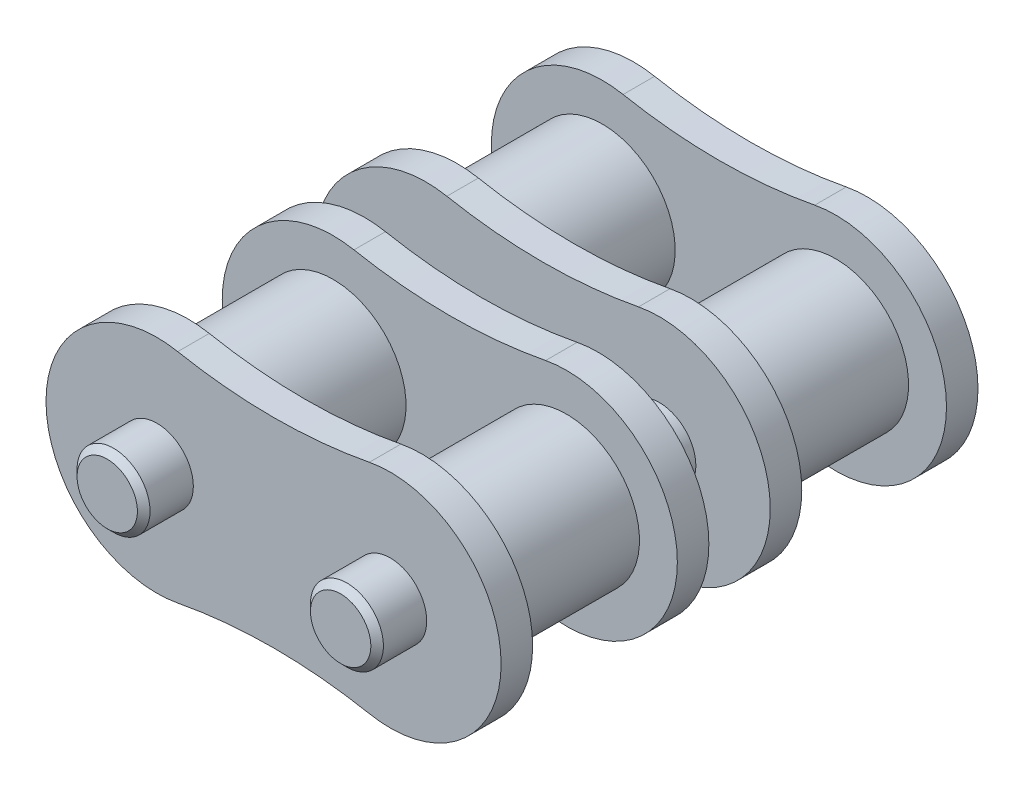
ISO-10303-21;
HEADER;
FILE_DESCRIPTION(('STEP AP214'),'2;1');
FILE_NAME('part.step','',(''),(''),'','','');
FILE_SCHEMA(('AUTOMOTIVE_DESIGN { 1 0 10303 214 1 1 1 1 }'));
ENDSEC;
DATA;
#1=APPLICATION_CONTEXT('core data for automotive mechanical design processes');
#2=APPLICATION_PROTOCOL_DEFINITION('international standard','automotive_design',2000,#1);
#3=PRODUCT_CONTEXT('',#1,'mechanical');
#4=PRODUCT('Part','Part','',(#3));
#5=PRODUCT_RELATED_PRODUCT_CATEGORY('part','',(#4));
#6=PRODUCT_DEFINITION_FORMATION('','',#4);
#7=PRODUCT_DEFINITION_CONTEXT('part definition',#1,'design');
#8=PRODUCT_DEFINITION('design','',#6,#7);
#9=PRODUCT_DEFINITION_SHAPE('','',#8);
#10=(LENGTH_UNIT() NAMED_UNIT(*) SI_UNIT(.MILLI.,.METRE.));
#11=(NAMED_UNIT(*) PLANE_ANGLE_UNIT() SI_UNIT($,.RADIAN.));
#12=(NAMED_UNIT(*) SI_UNIT($,.STERADIAN.) SOLID_ANGLE_UNIT());
#13=UNCERTAINTY_MEASURE_WITH_UNIT(LENGTH_MEASURE(1.E-05),#10,'distance_accuracy_value','');
#14=(GEOMETRIC_REPRESENTATION_CONTEXT(3) GLOBAL_UNCERTAINTY_ASSIGNED_CONTEXT((#13)) GLOBAL_UNIT_ASSIGNED_CONTEXT((#10,
#11,#12)) REPRESENTATION_CONTEXT('',''));
#15=CARTESIAN_POINT('',(0.,0.,0.));
#16=DIRECTION('',(0.,0.,1.));
#17=DIRECTION('',(1.,0.,0.));
#18=AXIS2_PLACEMENT_3D('',#15,#16,#17);
#19=CARTESIAN_POINT('',(-6.35,-33.119427631579,40.595));
#20=DIRECTION('',(0.,0.,1.));
#21=DIRECTION('',(1.,0.,0.));
#22=AXIS2_PLACEMENT_3D('',#19,#20,#21);
#23=PLANE('',#22);
#24=CARTESIAN_POINT('',(12.7,0.,40.595));
#25=DIRECTION('',(0.,0.,1.));
#26=DIRECTION('',(1.,0.,0.));
#27=AXIS2_PLACEMENT_3D('',#24,#25,#26);
#28=CIRCLE('',#27,3.97);
#29=CARTESIAN_POINT('',(16.67,0.,40.595));
#30=VERTEX_POINT('',#29);
#31=EDGE_CURVE('E243',#30,#30,#28,.F.);
#32=ORIENTED_EDGE('',*,*,#31,.T.);
#33=EDGE_LOOP('',(#32));
#34=FACE_BOUND('',#33,.T.);
#35=CARTESIAN_POINT('',(0.,-66.238855263158,40.595));
#36=DIRECTION('',(0.,0.,-1.));
#37=DIRECTION('',(1.,0.,0.));
#38=AXIS2_PLACEMENT_3D('',#35,#36,#37);
#39=CIRCLE('',#38,55.380355263158);
#40=CARTESIAN_POINT('',(-10.4281534154258,-11.8491745744655,40.595));
#41=VERTEX_POINT('',#40);
#42=CARTESIAN_POINT('',(10.4281534154258,-11.8491745744654,40.595));
#43=VERTEX_POINT('',#42);
#44=EDGE_CURVE('E286',#41,#43,#39,.T.);
#45=ORIENTED_EDGE('',*,*,#44,.T.);
#46=CARTESIAN_POINT('',(12.7,0.,40.595));
#47=DIRECTION('',(0.,0.,1.));
#48=DIRECTION('',(1.,0.,0.));
#49=AXIS2_PLACEMENT_3D('',#46,#47,#48);
#50=CIRCLE('',#49,12.065);
#51=CARTESIAN_POINT('',(10.4281534154258,11.8491745744655,40.595));
#52=VERTEX_POINT('',#51);
#53=EDGE_CURVE('E80',#43,#52,#50,.T.);
#54=ORIENTED_EDGE('',*,*,#53,.T.);
#55=CARTESIAN_POINT('',(0.,66.238855263158,40.595));
#56=DIRECTION('',(0.,0.,-1.));
#57=DIRECTION('',(1.,0.,0.));
#58=AXIS2_PLACEMENT_3D('',#55,#56,#57);
#59=CIRCLE('',#58,55.380355263158);
#60=CARTESIAN_POINT('',(-10.4281534154258,11.8491745744655,40.595));
#61=VERTEX_POINT('',#60);
#62=EDGE_CURVE('E289',#52,#61,#59,.T.);
#63=ORIENTED_EDGE('',*,*,#62,.T.);
#64=CARTESIAN_POINT('',(-12.7,0.,40.595));
#65=DIRECTION('',(0.,0.,1.));
#66=DIRECTION('',(1.,0.,0.));
#67=AXIS2_PLACEMENT_3D('',#64,#65,#66);
#68=CIRCLE('',#67,12.065);
#69=EDGE_CURVE('E48',#61,#41,#68,.T.);
#70=ORIENTED_EDGE('',*,*,#69,.T.);
#71=EDGE_LOOP('',(#45,#54,#63,#70));
#72=FACE_BOUND('',#71,.T.);
#73=CARTESIAN_POINT('',(-12.7,0.,40.595));
#74=DIRECTION('',(0.,0.,1.));
#75=DIRECTION('',(1.,0.,0.));
#76=AXIS2_PLACEMENT_3D('',#73,#74,#75);
#77=CIRCLE('',#76,3.97);
#78=CARTESIAN_POINT('',(-8.73,0.,40.595));
#79=VERTEX_POINT('',#78);
#80=EDGE_CURVE('E190',#79,#79,#77,.F.);
#81=ORIENTED_EDGE('',*,*,#80,.T.);
#82=EDGE_LOOP('',(#81));
#83=FACE_BOUND('',#82,.T.);
#84=ADVANCED_FACE('F31',(#34,#72,#83),#23,.T.);
#85=CARTESIAN_POINT('',(-6.35,-33.119427631579,17.985));
#86=DIRECTION('',(0.,0.,-1.));
#87=DIRECTION('',(1.,0.,0.));
#88=AXIS2_PLACEMENT_3D('',#85,#86,#87);
#89=PLANE('',#88);
#90=CARTESIAN_POINT('',(12.7,0.,17.985));
#91=DIRECTION('',(0.,0.,-1.));
#92=DIRECTION('',(-1.,0.,0.));
#93=AXIS2_PLACEMENT_3D('',#90,#91,#92);
#94=CIRCLE('',#93,3.97);
#95=CARTESIAN_POINT('',(8.73,0.,17.985));
#96=VERTEX_POINT('',#95);
#97=EDGE_CURVE('E247',#96,#96,#94,.F.);
#98=ORIENTED_EDGE('',*,*,#97,.T.);
#99=EDGE_LOOP('',(#98));
#100=FACE_BOUND('',#99,.T.);
#101=CARTESIAN_POINT('',(0.,-66.238855263158,17.985));
#102=DIRECTION('',(0.,0.,-1.));
#103=DIRECTION('',(1.,0.,0.));
#104=AXIS2_PLACEMENT_3D('',#101,#102,#103);
#105=CIRCLE('',#104,55.380355263158);
#106=CARTESIAN_POINT('',(-10.4281534154258,-11.8491745744655,17.985));
#107=VERTEX_POINT('',#106);
#108=CARTESIAN_POINT('',(10.4281534154258,-11.8491745744654,17.985));
#109=VERTEX_POINT('',#108);
#110=EDGE_CURVE('E248',#107,#109,#105,.T.);
#111=ORIENTED_EDGE('',*,*,#110,.F.);
#112=CARTESIAN_POINT('',(-12.7,0.,17.985));
#113=DIRECTION('',(0.,0.,1.));
#114=DIRECTION('',(1.,0.,0.));
#115=AXIS2_PLACEMENT_3D('',#112,#113,#114);
#116=CIRCLE('',#115,12.065);
#117=CARTESIAN_POINT('',(-10.4281534154258,11.8491745744655,17.985));
#118=VERTEX_POINT('',#117);
#119=EDGE_CURVE('E251',#118,#107,#116,.T.);
#120=ORIENTED_EDGE('',*,*,#119,.F.);
#121=CARTESIAN_POINT('',(0.,66.238855263158,17.985));
#122=DIRECTION('',(0.,0.,-1.));
#123=DIRECTION('',(1.,0.,0.));
#124=AXIS2_PLACEMENT_3D('',#121,#122,#123);
#125=CIRCLE('',#124,55.380355263158);
#126=CARTESIAN_POINT('',(10.4281534154258,11.8491745744655,17.985));
#127=VERTEX_POINT('',#126);
#128=EDGE_CURVE('E255',#127,#118,#125,.T.);
#129=ORIENTED_EDGE('',*,*,#128,.F.);
#130=CARTESIAN_POINT('',(12.7,0.,17.985));
#131=DIRECTION('',(0.,0.,1.));
#132=DIRECTION('',(1.,0.,0.));
#133=AXIS2_PLACEMENT_3D('',#130,#131,#132);
#134=CIRCLE('',#133,12.065);
#135=EDGE_CURVE('E258',#109,#127,#134,.T.);
#136=ORIENTED_EDGE('',*,*,#135,.F.);
#137=EDGE_LOOP('',(#111,#120,#129,#136));
#138=FACE_BOUND('',#137,.T.);
#139=CARTESIAN_POINT('',(-12.7,0.,17.985));
#140=DIRECTION('',(0.,0.,-1.));
#141=DIRECTION('',(-1.,0.,0.));
#142=AXIS2_PLACEMENT_3D('',#139,#140,#141);
#143=CIRCLE('',#142,3.97);
#144=CARTESIAN_POINT('',(-16.67,0.,17.985));
#145=VERTEX_POINT('',#144);
#146=EDGE_CURVE('E458',#145,#145,#143,.F.);
#147=ORIENTED_EDGE('',*,*,#146,.T.);
#148=EDGE_LOOP('',(#147));
#149=FACE_BOUND('',#148,.T.);
#150=ADVANCED_FACE('F355',(#100,#138,#149),#89,.T.);
#151=CARTESIAN_POINT('',(-6.35,-33.119427631579,11.305));
#152=DIRECTION('',(0.,0.,1.));
#153=DIRECTION('',(1.,0.,0.));
#154=AXIS2_PLACEMENT_3D('',#151,#152,#153);
#155=PLANE('',#154);
#156=CARTESIAN_POINT('',(12.7,0.,11.305));
#157=DIRECTION('',(0.,0.,1.));
#158=DIRECTION('',(1.,0.,0.));
#159=AXIS2_PLACEMENT_3D('',#156,#157,#158);
#160=CIRCLE('',#159,3.97);
#161=CARTESIAN_POINT('',(16.67,0.,11.305));
#162=VERTEX_POINT('',#161);
#163=EDGE_CURVE('E315',#162,#162,#160,.T.);
#164=ORIENTED_EDGE('',*,*,#163,.F.);
#165=EDGE_LOOP('',(#164));
#166=FACE_BOUND('',#165,.T.);
#167=CARTESIAN_POINT('',(0.,-66.238855263158,11.305));
#168=DIRECTION('',(0.,0.,-1.));
#169=DIRECTION('',(1.,0.,0.));
#170=AXIS2_PLACEMENT_3D('',#167,#168,#169);
#171=CIRCLE('',#170,55.380355263158);
#172=CARTESIAN_POINT('',(-10.4281534154258,-11.8491745744655,11.305));
#173=VERTEX_POINT('',#172);
#174=CARTESIAN_POINT('',(10.4281534154258,-11.8491745744654,11.305));
#175=VERTEX_POINT('',#174);
#176=EDGE_CURVE('E207',#173,#175,#171,.T.);
#177=ORIENTED_EDGE('',*,*,#176,.T.);
#178=CARTESIAN_POINT('',(12.7,0.,11.305));
#179=DIRECTION('',(0.,0.,1.));
#180=DIRECTION('',(1.,0.,0.));
#181=AXIS2_PLACEMENT_3D('',#178,#179,#180);
#182=CIRCLE('',#181,12.065);
#183=CARTESIAN_POINT('',(10.4281534154258,11.8491745744655,11.305));
#184=VERTEX_POINT('',#183);
#185=EDGE_CURVE('E210',#175,#184,#182,.T.);
#186=ORIENTED_EDGE('',*,*,#185,.T.);
#187=CARTESIAN_POINT('',(0.,66.238855263158,11.305));
#188=DIRECTION('',(0.,0.,-1.));
#189=DIRECTION('',(1.,0.,0.));
#190=AXIS2_PLACEMENT_3D('',#187,#188,#189);
#191=CIRCLE('',#190,55.380355263158);
#192=CARTESIAN_POINT('',(-10.4281534154258,11.8491745744655,11.305));
#193=VERTEX_POINT('',#192);
#194=EDGE_CURVE('E213',#184,#193,#191,.T.);
#195=ORIENTED_EDGE('',*,*,#194,.T.);
#196=CARTESIAN_POINT('',(-12.7,0.,11.305));
#197=DIRECTION('',(0.,0.,1.));
#198=DIRECTION('',(1.,0.,0.));
#199=AXIS2_PLACEMENT_3D('',#196,#197,#198);
#200=CIRCLE('',#199,12.065);
#201=EDGE_CURVE('E215',#193,#173,#200,.T.);
#202=ORIENTED_EDGE('',*,*,#201,.T.);
#203=EDGE_LOOP('',(#177,#186,#195,#202));
#204=FACE_BOUND('',#203,.T.);
#205=CARTESIAN_POINT('',(-12.7,0.,11.305));
#206=DIRECTION('',(0.,0.,1.));
#207=DIRECTION('',(1.,0.,0.));
#208=AXIS2_PLACEMENT_3D('',#205,#206,#207);
#209=CIRCLE('',#208,3.97);
#210=CARTESIAN_POINT('',(-8.73,0.,11.305));
#211=VERTEX_POINT('',#210);
#212=EDGE_CURVE('E323',#211,#211,#209,.F.);
#213=ORIENTED_EDGE('',*,*,#212,.T.);
#214=EDGE_LOOP('',(#213));
#215=FACE_BOUND('',#214,.T.);
#216=ADVANCED_FACE('F361',(#166,#204,#215),#155,.T.);
#217=CARTESIAN_POINT('',(-6.35,-33.119427631579,-11.305));
#218=DIRECTION('',(0.,0.,-1.));
#219=DIRECTION('',(1.,0.,0.));
#220=AXIS2_PLACEMENT_3D('',#217,#218,#219);
#221=PLANE('',#220);
#222=CARTESIAN_POINT('',(12.7,0.,-11.305));
#223=DIRECTION('',(0.,0.,-1.));
#224=DIRECTION('',(-1.,0.,0.));
#225=AXIS2_PLACEMENT_3D('',#222,#223,#224);
#226=CIRCLE('',#225,3.97);
#227=CARTESIAN_POINT('',(8.73,0.,-11.305));
#228=VERTEX_POINT('',#227);
#229=EDGE_CURVE('E242',#228,#228,#226,.T.);
#230=ORIENTED_EDGE('',*,*,#229,.F.);
#231=EDGE_LOOP('',(#230));
#232=FACE_BOUND('',#231,.T.);
#233=CARTESIAN_POINT('',(0.,-66.238855263158,-11.305));
#234=DIRECTION('',(0.,0.,-1.));
#235=DIRECTION('',(1.,0.,0.));
#236=AXIS2_PLACEMENT_3D('',#233,#234,#235);
#237=CIRCLE('',#236,55.380355263158);
#238=CARTESIAN_POINT('',(-10.4281534154258,-11.8491745744655,-11.305));
#239=VERTEX_POINT('',#238);
#240=CARTESIAN_POINT('',(10.4281534154258,-11.8491745744654,-11.305));
#241=VERTEX_POINT('',#240);
#242=EDGE_CURVE('E158',#239,#241,#237,.T.);
#243=ORIENTED_EDGE('',*,*,#242,.F.);
#244=CARTESIAN_POINT('',(-12.7,0.,-11.305));
#245=DIRECTION('',(0.,0.,1.));
#246=DIRECTION('',(1.,0.,0.));
#247=AXIS2_PLACEMENT_3D('',#244,#245,#246);
#248=CIRCLE('',#247,12.065);
#249=CARTESIAN_POINT('',(-10.4281534154258,11.8491745744655,-11.305));
#250=VERTEX_POINT('',#249);
#251=EDGE_CURVE('E174',#250,#239,#248,.T.);
#252=ORIENTED_EDGE('',*,*,#251,.F.);
#253=CARTESIAN_POINT('',(0.,66.238855263158,-11.305));
#254=DIRECTION('',(0.,0.,-1.));
#255=DIRECTION('',(1.,0.,0.));
#256=AXIS2_PLACEMENT_3D('',#253,#254,#255);
#257=CIRCLE('',#256,55.380355263158);
#258=CARTESIAN_POINT('',(10.4281534154258,11.8491745744655,-11.305));
#259=VERTEX_POINT('',#258);
#260=EDGE_CURVE('E181',#259,#250,#257,.T.);
#261=ORIENTED_EDGE('',*,*,#260,.F.);
#262=CARTESIAN_POINT('',(12.7,0.,-11.305));
#263=DIRECTION('',(0.,0.,1.));
#264=DIRECTION('',(1.,0.,0.));
#265=AXIS2_PLACEMENT_3D('',#262,#263,#264);
#266=CIRCLE('',#265,12.065);
#267=EDGE_CURVE('E177',#241,#259,#266,.T.);
#268=ORIENTED_EDGE('',*,*,#267,.F.);
#269=EDGE_LOOP('',(#243,#252,#261,#268));
#270=FACE_BOUND('',#269,.T.);
#271=CARTESIAN_POINT('',(-12.7,0.,-11.305));
#272=DIRECTION('',(0.,0.,-1.));
#273=DIRECTION('',(-1.,0.,0.));
#274=AXIS2_PLACEMENT_3D('',#271,#272,#273);
#275=CIRCLE('',#274,3.97);
#276=CARTESIAN_POINT('',(-16.67,0.,-11.305));
#277=VERTEX_POINT('',#276);
#278=EDGE_CURVE('E320',#277,#277,#275,.F.);
#279=ORIENTED_EDGE('',*,*,#278,.T.);
#280=EDGE_LOOP('',(#279));
#281=FACE_BOUND('',#280,.T.);
#282=ADVANCED_FACE('F171',(#232,#270,#281),#221,.T.);
#283=CARTESIAN_POINT('',(12.7,0.,45.995));
#284=DIRECTION('',(0.,0.,-1.));
#285=DIRECTION('',(-1.,0.,0.));
#286=AXIS2_PLACEMENT_3D('',#283,#284,#285);
#287=CYLINDRICAL_SURFACE('',#286,3.97);
#288=ORIENTED_EDGE('',*,*,#163,.T.);
#289=EDGE_LOOP('',(#288));
#290=FACE_BOUND('',#289,.T.);
#291=ORIENTED_EDGE('',*,*,#97,.F.);
#292=EDGE_LOOP('',(#291));
#293=FACE_BOUND('',#292,.T.);
#294=ADVANCED_FACE('F372',(#290,#293),#287,.T.);
#295=CARTESIAN_POINT('',(-6.35,-33.119427631579,37.165));
#296=DIRECTION('',(0.,0.,1.));
#297=DIRECTION('',(1.,0.,0.));
#298=AXIS2_PLACEMENT_3D('',#295,#296,#297);
#299=PLANE('',#298);
#300=CARTESIAN_POINT('',(12.7,0.,37.165));
#301=DIRECTION('',(0.,0.,1.));
#302=DIRECTION('',(1.,0.,0.));
#303=AXIS2_PLACEMENT_3D('',#300,#301,#302);
#304=CIRCLE('',#303,7.94);
#305=CARTESIAN_POINT('',(20.64,0.,37.165));
#306=VERTEX_POINT('',#305);
#307=EDGE_CURVE('E306',#306,#306,#304,.T.);
#308=ORIENTED_EDGE('',*,*,#307,.T.);
#309=EDGE_LOOP('',(#308));
#310=FACE_BOUND('',#309,.T.);
#311=CARTESIAN_POINT('',(0.,-66.238855263158,37.165));
#312=DIRECTION('',(0.,0.,-1.));
#313=DIRECTION('',(1.,0.,0.));
#314=AXIS2_PLACEMENT_3D('',#311,#312,#313);
#315=CIRCLE('',#314,55.380355263158);
#316=CARTESIAN_POINT('',(-10.4281534154258,-11.8491745744655,37.165));
#317=VERTEX_POINT('',#316);
#318=CARTESIAN_POINT('',(10.4281534154258,-11.8491745744654,37.165));
#319=VERTEX_POINT('',#318);
#320=EDGE_CURVE('E285',#317,#319,#315,.T.);
#321=ORIENTED_EDGE('',*,*,#320,.F.);
#322=CARTESIAN_POINT('',(-12.7,0.,37.165));
#323=DIRECTION('',(0.,0.,1.));
#324=DIRECTION('',(1.,0.,0.));
#325=AXIS2_PLACEMENT_3D('',#322,#323,#324);
#326=CIRCLE('',#325,12.065);
#327=CARTESIAN_POINT('',(-10.4281534154258,11.8491745744655,37.165));
#328=VERTEX_POINT('',#327);
#329=EDGE_CURVE('E72',#328,#317,#326,.T.);
#330=ORIENTED_EDGE('',*,*,#329,.F.);
#331=CARTESIAN_POINT('',(0.,66.238855263158,37.165));
#332=DIRECTION('',(0.,0.,-1.));
#333=DIRECTION('',(1.,0.,0.));
#334=AXIS2_PLACEMENT_3D('',#331,#332,#333);
#335=CIRCLE('',#334,55.380355263158);
#336=CARTESIAN_POINT('',(10.4281534154258,11.8491745744655,37.165));
#337=VERTEX_POINT('',#336);
#338=EDGE_CURVE('E66',#337,#328,#335,.T.);
#339=ORIENTED_EDGE('',*,*,#338,.F.);
#340=CARTESIAN_POINT('',(12.7,0.,37.165));
#341=DIRECTION('',(0.,0.,1.));
#342=DIRECTION('',(1.,0.,0.));
#343=AXIS2_PLACEMENT_3D('',#340,#341,#342);
#344=CIRCLE('',#343,12.065);
#345=EDGE_CURVE('E295',#319,#337,#344,.T.);
#346=ORIENTED_EDGE('',*,*,#345,.F.);
#347=EDGE_LOOP('',(#321,#330,#339,#346));
#348=FACE_BOUND('',#347,.T.);
#349=CARTESIAN_POINT('',(-12.7,0.,37.165));
#350=DIRECTION('',(0.,0.,1.));
#351=DIRECTION('',(1.,0.,0.));
#352=AXIS2_PLACEMENT_3D('',#349,#350,#351);
#353=CIRCLE('',#352,7.94);
#354=CARTESIAN_POINT('',(-4.76,0.,37.165));
#355=VERTEX_POINT('',#354);
#356=EDGE_CURVE('E309',#355,#355,#353,.F.);
#357=ORIENTED_EDGE('',*,*,#356,.F.);
#358=EDGE_LOOP('',(#357));
#359=FACE_BOUND('',#358,.T.);
#360=ADVANCED_FACE('F368',(#310,#348,#359),#299,.F.);
#361=CARTESIAN_POINT('',(12.7,0.,37.165));
#362=DIRECTION('',(0.,0.,-1.));
#363=DIRECTION('',(-1.,0.,0.));
#364=AXIS2_PLACEMENT_3D('',#361,#362,#363);
#365=CYLINDRICAL_SURFACE('',#364,7.94);
#366=ORIENTED_EDGE('',*,*,#307,.F.);
#367=EDGE_LOOP('',(#366));
#368=FACE_BOUND('',#367,.T.);
#369=CARTESIAN_POINT('',(12.7,0.,21.415));
#370=DIRECTION('',(0.,0.,-1.));
#371=DIRECTION('',(-1.,0.,0.));
#372=AXIS2_PLACEMENT_3D('',#369,#370,#371);
#373=CIRCLE('',#372,7.94);
#374=CARTESIAN_POINT('',(4.76,0.,21.415));
#375=VERTEX_POINT('',#374);
#376=EDGE_CURVE('E282',#375,#375,#373,.T.);
#377=ORIENTED_EDGE('',*,*,#376,.F.);
#378=EDGE_LOOP('',(#377));
#379=FACE_BOUND('',#378,.T.);
#380=ADVANCED_FACE('F371',(#368,#379),#365,.T.);
#381=CARTESIAN_POINT('',(0.,-66.238855263158,40.595));
#382=DIRECTION('',(0.,0.,-1.));
#383=DIRECTION('',(-1.,0.,0.));
#384=AXIS2_PLACEMENT_3D('',#381,#382,#383);
#385=CYLINDRICAL_SURFACE('',#384,55.380355263158);
#386=ORIENTED_EDGE('',*,*,#320,.T.);
#387=DIRECTION('',(0.,0.,-1.));
#388=VECTOR('',#387,1.);
#389=CARTESIAN_POINT('',(10.4281534154258,-11.8491745744654,40.595));
#390=LINE('',#389,#388);
#391=EDGE_CURVE('E304',#43,#319,#390,.T.);
#392=ORIENTED_EDGE('',*,*,#391,.F.);
#393=ORIENTED_EDGE('',*,*,#44,.F.);
#394=DIRECTION('',(0.,0.,-1.));
#395=VECTOR('',#394,1.);
#396=CARTESIAN_POINT('',(-10.4281534154258,-11.8491745744655,40.595));
#397=LINE('',#396,#395);
#398=EDGE_CURVE('E292',#41,#317,#397,.T.);
#399=ORIENTED_EDGE('',*,*,#398,.T.);
#400=EDGE_LOOP('',(#386,#392,#393,#399));
#401=FACE_BOUND('',#400,.T.);
#402=ADVANCED_FACE('F383',(#401),#385,.F.);
#403=CARTESIAN_POINT('',(12.7,0.,40.595));
#404=DIRECTION('',(0.,0.,-1.));
#405=DIRECTION('',(-1.,0.,0.));
#406=AXIS2_PLACEMENT_3D('',#403,#404,#405);
#407=CYLINDRICAL_SURFACE('',#406,12.065);
#408=ORIENTED_EDGE('',*,*,#345,.T.);
#409=DIRECTION('',(0.,0.,-1.));
#410=VECTOR('',#409,1.);
#411=CARTESIAN_POINT('',(10.4281534154258,11.8491745744655,40.595));
#412=LINE('',#411,#410);
#413=EDGE_CURVE('E302',#52,#337,#412,.T.);
#414=ORIENTED_EDGE('',*,*,#413,.F.);
#415=ORIENTED_EDGE('',*,*,#53,.F.);
#416=ORIENTED_EDGE('',*,*,#391,.T.);
#417=EDGE_LOOP('',(#408,#414,#415,#416));
#418=FACE_BOUND('',#417,.T.);
#419=ADVANCED_FACE('F380',(#418),#407,.T.);
#420=CARTESIAN_POINT('',(0.,66.238855263158,40.595));
#421=DIRECTION('',(0.,0.,-1.));
#422=DIRECTION('',(-1.,0.,0.));
#423=AXIS2_PLACEMENT_3D('',#420,#421,#422);
#424=CYLINDRICAL_SURFACE('',#423,55.380355263158);
#425=ORIENTED_EDGE('',*,*,#338,.T.);
#426=DIRECTION('',(0.,0.,-1.));
#427=VECTOR('',#426,1.);
#428=CARTESIAN_POINT('',(-10.4281534154258,11.8491745744655,40.595));
#429=LINE('',#428,#427);
#430=EDGE_CURVE('E300',#61,#328,#429,.T.);
#431=ORIENTED_EDGE('',*,*,#430,.F.);
#432=ORIENTED_EDGE('',*,*,#62,.F.);
#433=ORIENTED_EDGE('',*,*,#413,.T.);
#434=EDGE_LOOP('',(#425,#431,#432,#433));
#435=FACE_BOUND('',#434,.T.);
#436=ADVANCED_FACE('F377',(#435),#424,.F.);
#437=CARTESIAN_POINT('',(-12.7,0.,40.595));
#438=DIRECTION('',(0.,0.,-1.));
#439=DIRECTION('',(-1.,0.,0.));
#440=AXIS2_PLACEMENT_3D('',#437,#438,#439);
#441=CYLINDRICAL_SURFACE('',#440,12.065);
#442=ORIENTED_EDGE('',*,*,#329,.T.);
#443=ORIENTED_EDGE('',*,*,#398,.F.);
#444=ORIENTED_EDGE('',*,*,#69,.F.);
#445=ORIENTED_EDGE('',*,*,#430,.T.);
#446=EDGE_LOOP('',(#442,#443,#444,#445));
#447=FACE_BOUND('',#446,.T.);
#448=ADVANCED_FACE('F374',(#447),#441,.T.);
#449=CARTESIAN_POINT('',(-12.7,0.,37.165));
#450=DIRECTION('',(0.,0.,-1.));
#451=DIRECTION('',(-1.,0.,0.));
#452=AXIS2_PLACEMENT_3D('',#449,#450,#451);
#453=CYLINDRICAL_SURFACE('',#452,7.94);
#454=ORIENTED_EDGE('',*,*,#356,.T.);
#455=EDGE_LOOP('',(#454));
#456=FACE_BOUND('',#455,.T.);
#457=CARTESIAN_POINT('',(-12.7,0.,21.415));
#458=DIRECTION('',(0.,0.,-1.));
#459=DIRECTION('',(-1.,0.,0.));
#460=AXIS2_PLACEMENT_3D('',#457,#458,#459);
#461=CIRCLE('',#460,7.94);
#462=CARTESIAN_POINT('',(-20.64,0.,21.415));
#463=VERTEX_POINT('',#462);
#464=EDGE_CURVE('E279',#463,#463,#461,.T.);
#465=ORIENTED_EDGE('',*,*,#464,.F.);
#466=EDGE_LOOP('',(#465));
#467=FACE_BOUND('',#466,.T.);
#468=ADVANCED_FACE('F366',(#456,#467),#453,.T.);
#469=CARTESIAN_POINT('',(-6.35,-33.119427631579,21.415));
#470=DIRECTION('',(0.,0.,-1.));
#471=DIRECTION('',(1.,0.,0.));
#472=AXIS2_PLACEMENT_3D('',#469,#470,#471);
#473=PLANE('',#472);
#474=ORIENTED_EDGE('',*,*,#464,.T.);
#475=EDGE_LOOP('',(#474));
#476=FACE_BOUND('',#475,.T.);
#477=CARTESIAN_POINT('',(0.,-66.238855263158,21.415));
#478=DIRECTION('',(0.,0.,-1.));
#479=DIRECTION('',(1.,0.,0.));
#480=AXIS2_PLACEMENT_3D('',#477,#478,#479);
#481=CIRCLE('',#480,55.380355263158);
#482=CARTESIAN_POINT('',(-10.4281534154258,-11.8491745744655,21.415));
#483=VERTEX_POINT('',#482);
#484=CARTESIAN_POINT('',(10.4281534154258,-11.8491745744654,21.415));
#485=VERTEX_POINT('',#484);
#486=EDGE_CURVE('E246',#483,#485,#481,.T.);
#487=ORIENTED_EDGE('',*,*,#486,.T.);
#488=CARTESIAN_POINT('',(12.7,0.,21.415));
#489=DIRECTION('',(0.,0.,1.));
#490=DIRECTION('',(1.,0.,0.));
#491=AXIS2_PLACEMENT_3D('',#488,#489,#490);
#492=CIRCLE('',#491,12.065);
#493=CARTESIAN_POINT('',(10.4281534154258,11.8491745744655,21.415));
#494=VERTEX_POINT('',#493);
#495=EDGE_CURVE('E252',#485,#494,#492,.T.);
#496=ORIENTED_EDGE('',*,*,#495,.T.);
#497=CARTESIAN_POINT('',(0.,66.238855263158,21.415));
#498=DIRECTION('',(0.,0.,-1.));
#499=DIRECTION('',(1.,0.,0.));
#500=AXIS2_PLACEMENT_3D('',#497,#498,#499);
#501=CIRCLE('',#500,55.380355263158);
#502=CARTESIAN_POINT('',(-10.4281534154258,11.8491745744655,21.415));
#503=VERTEX_POINT('',#502);
#504=EDGE_CURVE('E267',#494,#503,#501,.T.);
#505=ORIENTED_EDGE('',*,*,#504,.T.);
#506=CARTESIAN_POINT('',(-12.7,0.,21.415));
#507=DIRECTION('',(0.,0.,1.));
#508=DIRECTION('',(1.,0.,0.));
#509=AXIS2_PLACEMENT_3D('',#506,#507,#508);
#510=CIRCLE('',#509,12.065);
#511=EDGE_CURVE('E264',#503,#483,#510,.T.);
#512=ORIENTED_EDGE('',*,*,#511,.T.);
#513=EDGE_LOOP('',(#487,#496,#505,#512));
#514=FACE_BOUND('',#513,.T.);
#515=ORIENTED_EDGE('',*,*,#376,.T.);
#516=EDGE_LOOP('',(#515));
#517=FACE_BOUND('',#516,.T.);
#518=ADVANCED_FACE('F425',(#476,#514,#517),#473,.F.);
#519=CARTESIAN_POINT('',(0.,-66.238855263158,17.985));
#520=DIRECTION('',(0.,0.,1.));
#521=DIRECTION('',(1.,0.,0.));
#522=AXIS2_PLACEMENT_3D('',#519,#520,#521);
#523=CYLINDRICAL_SURFACE('',#522,55.380355263158);
#524=ORIENTED_EDGE('',*,*,#486,.F.);
#525=DIRECTION('',(0.,0.,1.));
#526=VECTOR('',#525,1.);
#527=CARTESIAN_POINT('',(-10.4281534154258,-11.8491745744655,17.985));
#528=LINE('',#527,#526);
#529=EDGE_CURVE('E277',#107,#483,#528,.T.);
#530=ORIENTED_EDGE('',*,*,#529,.F.);
#531=ORIENTED_EDGE('',*,*,#110,.T.);
#532=DIRECTION('',(0.,0.,1.));
#533=VECTOR('',#532,1.);
#534=CARTESIAN_POINT('',(10.4281534154258,-11.8491745744654,17.985));
#535=LINE('',#534,#533);
#536=EDGE_CURVE('E261',#109,#485,#535,.T.);
#537=ORIENTED_EDGE('',*,*,#536,.T.);
#538=EDGE_LOOP('',(#524,#530,#531,#537));
#539=FACE_BOUND('',#538,.T.);
#540=ADVANCED_FACE('F428',(#539),#523,.F.);
#541=CARTESIAN_POINT('',(-12.7,0.,17.985));
#542=DIRECTION('',(0.,0.,1.));
#543=DIRECTION('',(1.,0.,0.));
#544=AXIS2_PLACEMENT_3D('',#541,#542,#543);
#545=CYLINDRICAL_SURFACE('',#544,12.065);
#546=ORIENTED_EDGE('',*,*,#511,.F.);
#547=DIRECTION('',(0.,0.,1.));
#548=VECTOR('',#547,1.);
#549=CARTESIAN_POINT('',(-10.4281534154258,11.8491745744655,17.985));
#550=LINE('',#549,#548);
#551=EDGE_CURVE('E275',#118,#503,#550,.T.);
#552=ORIENTED_EDGE('',*,*,#551,.F.);
#553=ORIENTED_EDGE('',*,*,#119,.T.);
#554=ORIENTED_EDGE('',*,*,#529,.T.);
#555=EDGE_LOOP('',(#546,#552,#553,#554));
#556=FACE_BOUND('',#555,.T.);
#557=ADVANCED_FACE('F436',(#556),#545,.T.);
#558=CARTESIAN_POINT('',(0.,66.238855263158,17.985));
#559=DIRECTION('',(0.,0.,1.));
#560=DIRECTION('',(1.,0.,0.));
#561=AXIS2_PLACEMENT_3D('',#558,#559,#560);
#562=CYLINDRICAL_SURFACE('',#561,55.380355263158);
#563=ORIENTED_EDGE('',*,*,#504,.F.);
#564=DIRECTION('',(0.,0.,1.));
#565=VECTOR('',#564,1.);
#566=CARTESIAN_POINT('',(10.4281534154258,11.8491745744655,17.985));
#567=LINE('',#566,#565);
#568=EDGE_CURVE('E273',#127,#494,#567,.T.);
#569=ORIENTED_EDGE('',*,*,#568,.F.);
#570=ORIENTED_EDGE('',*,*,#128,.T.);
#571=ORIENTED_EDGE('',*,*,#551,.T.);
#572=EDGE_LOOP('',(#563,#569,#570,#571));
#573=FACE_BOUND('',#572,.T.);
#574=ADVANCED_FACE('F432',(#573),#562,.F.);
#575=CARTESIAN_POINT('',(12.7,0.,17.985));
#576=DIRECTION('',(0.,0.,1.));
#577=DIRECTION('',(1.,0.,0.));
#578=AXIS2_PLACEMENT_3D('',#575,#576,#577);
#579=CYLINDRICAL_SURFACE('',#578,12.065);
#580=ORIENTED_EDGE('',*,*,#495,.F.);
#581=ORIENTED_EDGE('',*,*,#536,.F.);
#582=ORIENTED_EDGE('',*,*,#135,.T.);
#583=ORIENTED_EDGE('',*,*,#568,.T.);
#584=EDGE_LOOP('',(#580,#581,#582,#583));
#585=FACE_BOUND('',#584,.T.);
#586=ADVANCED_FACE('F414',(#585),#579,.T.);
#587=CARTESIAN_POINT('',(12.7,0.,45.309));
#588=DIRECTION('',(0.,0.,1.));
#589=DIRECTION('',(1.,0.,0.));
#590=AXIS2_PLACEMENT_3D('',#587,#588,#589);
#591=CIRCLE('',#590,3.97);
#592=CARTESIAN_POINT('',(8.73,0.,45.309));
#593=VERTEX_POINT('',#592);
#594=EDGE_CURVE('E332',#593,#593,#591,.F.);
#595=ORIENTED_EDGE('',*,*,#594,.T.);
#596=EDGE_LOOP('',(#595));
#597=FACE_BOUND('',#596,.T.);
#598=ORIENTED_EDGE('',*,*,#31,.F.);
#599=EDGE_LOOP('',(#598));
#600=FACE_BOUND('',#599,.T.);
#601=ADVANCED_FACE('F405',(#597,#600),#287,.T.);
#602=CARTESIAN_POINT('',(12.7,0.,45.995));
#603=DIRECTION('',(0.,0.,1.));
#604=DIRECTION('',(1.,0.,0.));
#605=AXIS2_PLACEMENT_3D('',#602,#603,#604);
#606=PLANE('',#605);
#607=CARTESIAN_POINT('',(12.7,0.,45.995));
#608=DIRECTION('',(0.,0.,1.));
#609=DIRECTION('',(1.,0.,0.));
#610=AXIS2_PLACEMENT_3D('',#607,#608,#609);
#611=CIRCLE('',#610,3.28399999999999);
#612=CARTESIAN_POINT('',(9.41600000000001,0.,45.995));
#613=VERTEX_POINT('',#612);
#614=EDGE_CURVE('E329',#613,#613,#611,.T.);
#615=ORIENTED_EDGE('',*,*,#614,.T.);
#616=EDGE_LOOP('',(#615));
#617=FACE_BOUND('',#616,.T.);
#618=ADVANCED_FACE('F402',(#617),#606,.T.);
#619=CARTESIAN_POINT('',(-6.35,-33.119427631579,7.875));
#620=DIRECTION('',(0.,0.,1.));
#621=DIRECTION('',(1.,0.,0.));
#622=AXIS2_PLACEMENT_3D('',#619,#620,#621);
#623=PLANE('',#622);
#624=CARTESIAN_POINT('',(12.7,0.,7.875));
#625=DIRECTION('',(0.,0.,1.));
#626=DIRECTION('',(1.,0.,0.));
#627=AXIS2_PLACEMENT_3D('',#624,#625,#626);
#628=CIRCLE('',#627,7.94);
#629=CARTESIAN_POINT('',(20.64,0.,7.875));
#630=VERTEX_POINT('',#629);
#631=EDGE_CURVE('E236',#630,#630,#628,.T.);
#632=ORIENTED_EDGE('',*,*,#631,.T.);
#633=EDGE_LOOP('',(#632));
#634=FACE_BOUND('',#633,.T.);
#635=CARTESIAN_POINT('',(0.,-66.238855263158,7.875));
#636=DIRECTION('',(0.,0.,-1.));
#637=DIRECTION('',(1.,0.,0.));
#638=AXIS2_PLACEMENT_3D('',#635,#636,#637);
#639=CIRCLE('',#638,55.380355263158);
#640=CARTESIAN_POINT('',(-10.4281534154258,-11.8491745744655,7.875));
#641=VERTEX_POINT('',#640);
#642=CARTESIAN_POINT('',(10.4281534154258,-11.8491745744654,7.875));
#643=VERTEX_POINT('',#642);
#644=EDGE_CURVE('E206',#641,#643,#639,.T.);
#645=ORIENTED_EDGE('',*,*,#644,.F.);
#646=CARTESIAN_POINT('',(-12.7,0.,7.875));
#647=DIRECTION('',(0.,0.,1.));
#648=DIRECTION('',(1.,0.,0.));
#649=AXIS2_PLACEMENT_3D('',#646,#647,#648);
#650=CIRCLE('',#649,12.065);
#651=CARTESIAN_POINT('',(-10.4281534154258,11.8491745744655,7.875));
#652=VERTEX_POINT('',#651);
#653=EDGE_CURVE('E211',#652,#641,#650,.T.);
#654=ORIENTED_EDGE('',*,*,#653,.F.);
#655=CARTESIAN_POINT('',(0.,66.238855263158,7.875));
#656=DIRECTION('',(0.,0.,-1.));
#657=DIRECTION('',(1.,0.,0.));
#658=AXIS2_PLACEMENT_3D('',#655,#656,#657);
#659=CIRCLE('',#658,55.380355263158);
#660=CARTESIAN_POINT('',(10.4281534154258,11.8491745744655,7.875));
#661=VERTEX_POINT('',#660);
#662=EDGE_CURVE('E222',#661,#652,#659,.T.);
#663=ORIENTED_EDGE('',*,*,#662,.F.);
#664=CARTESIAN_POINT('',(12.7,0.,7.875));
#665=DIRECTION('',(0.,0.,1.));
#666=DIRECTION('',(1.,0.,0.));
#667=AXIS2_PLACEMENT_3D('',#664,#665,#666);
#668=CIRCLE('',#667,12.065);
#669=EDGE_CURVE('E220',#643,#661,#668,.T.);
#670=ORIENTED_EDGE('',*,*,#669,.F.);
#671=EDGE_LOOP('',(#645,#654,#663,#670));
#672=FACE_BOUND('',#671,.T.);
#673=CARTESIAN_POINT('',(-12.7,0.,7.875));
#674=DIRECTION('',(0.,0.,1.));
#675=DIRECTION('',(1.,0.,0.));
#676=AXIS2_PLACEMENT_3D('',#673,#674,#675);
#677=CIRCLE('',#676,7.94);
#678=CARTESIAN_POINT('',(-4.76,0.,7.875));
#679=VERTEX_POINT('',#678);
#680=EDGE_CURVE('E239',#679,#679,#677,.F.);
#681=ORIENTED_EDGE('',*,*,#680,.F.);
#682=EDGE_LOOP('',(#681));
#683=FACE_BOUND('',#682,.T.);
#684=ADVANCED_FACE('F404',(#634,#672,#683),#623,.F.);
#685=CARTESIAN_POINT('',(12.7,0.,7.875));
#686=DIRECTION('',(0.,0.,-1.));
#687=DIRECTION('',(-1.,0.,0.));
#688=AXIS2_PLACEMENT_3D('',#685,#686,#687);
#689=CYLINDRICAL_SURFACE('',#688,7.94);
#690=ORIENTED_EDGE('',*,*,#631,.F.);
#691=EDGE_LOOP('',(#690));
#692=FACE_BOUND('',#691,.T.);
#693=CARTESIAN_POINT('',(12.7,0.,-7.875));
#694=DIRECTION('',(0.,0.,-1.));
#695=DIRECTION('',(-1.,0.,0.));
#696=AXIS2_PLACEMENT_3D('',#693,#694,#695);
#697=CIRCLE('',#696,7.94);
#698=CARTESIAN_POINT('',(4.76,0.,-7.875));
#699=VERTEX_POINT('',#698);
#700=EDGE_CURVE('E203',#699,#699,#697,.T.);
#701=ORIENTED_EDGE('',*,*,#700,.F.);
#702=EDGE_LOOP('',(#701));
#703=FACE_BOUND('',#702,.T.);
#704=ADVANCED_FACE('F411',(#692,#703),#689,.T.);
#705=CARTESIAN_POINT('',(0.,-66.238855263158,11.305));
#706=DIRECTION('',(0.,0.,-1.));
#707=DIRECTION('',(-1.,0.,0.));
#708=AXIS2_PLACEMENT_3D('',#705,#706,#707);
#709=CYLINDRICAL_SURFACE('',#708,55.380355263158);
#710=ORIENTED_EDGE('',*,*,#644,.T.);
#711=DIRECTION('',(0.,0.,-1.));
#712=VECTOR('',#711,1.);
#713=CARTESIAN_POINT('',(10.4281534154258,-11.8491745744654,11.305));
#714=LINE('',#713,#712);
#715=EDGE_CURVE('E233',#175,#643,#714,.T.);
#716=ORIENTED_EDGE('',*,*,#715,.F.);
#717=ORIENTED_EDGE('',*,*,#176,.F.);
#718=DIRECTION('',(0.,0.,-1.));
#719=VECTOR('',#718,1.);
#720=CARTESIAN_POINT('',(-10.4281534154258,-11.8491745744655,11.305));
#721=LINE('',#720,#719);
#722=EDGE_CURVE('E217',#173,#641,#721,.T.);
#723=ORIENTED_EDGE('',*,*,#722,.T.);
#724=EDGE_LOOP('',(#710,#716,#717,#723));
#725=FACE_BOUND('',#724,.T.);
#726=ADVANCED_FACE('F518',(#725),#709,.F.);
#727=CARTESIAN_POINT('',(12.7,0.,11.305));
#728=DIRECTION('',(0.,0.,-1.));
#729=DIRECTION('',(-1.,0.,0.));
#730=AXIS2_PLACEMENT_3D('',#727,#728,#729);
#731=CYLINDRICAL_SURFACE('',#730,12.065);
#732=ORIENTED_EDGE('',*,*,#669,.T.);
#733=DIRECTION('',(0.,0.,-1.));
#734=VECTOR('',#733,1.);
#735=CARTESIAN_POINT('',(10.4281534154258,11.8491745744655,11.305));
#736=LINE('',#735,#734);
#737=EDGE_CURVE('E230',#184,#661,#736,.T.);
#738=ORIENTED_EDGE('',*,*,#737,.F.);
#739=ORIENTED_EDGE('',*,*,#185,.F.);
#740=ORIENTED_EDGE('',*,*,#715,.T.);
#741=EDGE_LOOP('',(#732,#738,#739,#740));
#742=FACE_BOUND('',#741,.T.);
#743=ADVANCED_FACE('F514',(#742),#731,.T.);
#744=CARTESIAN_POINT('',(0.,66.238855263158,11.305));
#745=DIRECTION('',(0.,0.,-1.));
#746=DIRECTION('',(-1.,0.,0.));
#747=AXIS2_PLACEMENT_3D('',#744,#745,#746);
#748=CYLINDRICAL_SURFACE('',#747,55.380355263158);
#749=ORIENTED_EDGE('',*,*,#662,.T.);
#750=DIRECTION('',(0.,0.,-1.));
#751=VECTOR('',#750,1.);
#752=CARTESIAN_POINT('',(-10.4281534154258,11.8491745744655,11.305));
#753=LINE('',#752,#751);
#754=EDGE_CURVE('E227',#193,#652,#753,.T.);
#755=ORIENTED_EDGE('',*,*,#754,.F.);
#756=ORIENTED_EDGE('',*,*,#194,.F.);
#757=ORIENTED_EDGE('',*,*,#737,.T.);
#758=EDGE_LOOP('',(#749,#755,#756,#757));
#759=FACE_BOUND('',#758,.T.);
#760=ADVANCED_FACE('F510',(#759),#748,.F.);
#761=CARTESIAN_POINT('',(-12.7,0.,11.305));
#762=DIRECTION('',(0.,0.,-1.));
#763=DIRECTION('',(-1.,0.,0.));
#764=AXIS2_PLACEMENT_3D('',#761,#762,#763);
#765=CYLINDRICAL_SURFACE('',#764,12.065);
#766=ORIENTED_EDGE('',*,*,#653,.T.);
#767=ORIENTED_EDGE('',*,*,#722,.F.);
#768=ORIENTED_EDGE('',*,*,#201,.F.);
#769=ORIENTED_EDGE('',*,*,#754,.T.);
#770=EDGE_LOOP('',(#766,#767,#768,#769));
#771=FACE_BOUND('',#770,.T.);
#772=ADVANCED_FACE('F503',(#771),#765,.T.);
#773=CARTESIAN_POINT('',(-12.7,0.,7.875));
#774=DIRECTION('',(0.,0.,-1.));
#775=DIRECTION('',(-1.,0.,0.));
#776=AXIS2_PLACEMENT_3D('',#773,#774,#775);
#777=CYLINDRICAL_SURFACE('',#776,7.94);
#778=ORIENTED_EDGE('',*,*,#680,.T.);
#779=EDGE_LOOP('',(#778));
#780=FACE_BOUND('',#779,.T.);
#781=CARTESIAN_POINT('',(-12.7,0.,-7.875));
#782=DIRECTION('',(0.,0.,-1.));
#783=DIRECTION('',(-1.,0.,0.));
#784=AXIS2_PLACEMENT_3D('',#781,#782,#783);
#785=CIRCLE('',#784,7.94);
#786=CARTESIAN_POINT('',(-20.64,0.,-7.875));
#787=VERTEX_POINT('',#786);
#788=EDGE_CURVE('E166',#787,#787,#785,.T.);
#789=ORIENTED_EDGE('',*,*,#788,.F.);
#790=EDGE_LOOP('',(#789));
#791=FACE_BOUND('',#790,.T.);
#792=ADVANCED_FACE('F487',(#780,#791),#777,.T.);
#793=CARTESIAN_POINT('',(-6.35,-33.119427631579,-7.875));
#794=DIRECTION('',(0.,0.,-1.));
#795=DIRECTION('',(1.,0.,0.));
#796=AXIS2_PLACEMENT_3D('',#793,#794,#795);
#797=PLANE('',#796);
#798=ORIENTED_EDGE('',*,*,#788,.T.);
#799=EDGE_LOOP('',(#798));
#800=FACE_BOUND('',#799,.T.);
#801=CARTESIAN_POINT('',(0.,-66.238855263158,-7.875));
#802=DIRECTION('',(0.,0.,-1.));
#803=DIRECTION('',(1.,0.,0.));
#804=AXIS2_PLACEMENT_3D('',#801,#802,#803);
#805=CIRCLE('',#804,55.380355263158);
#806=CARTESIAN_POINT('',(-10.4281534154258,-11.8491745744655,-7.875));
#807=VERTEX_POINT('',#806);
#808=CARTESIAN_POINT('',(10.4281534154258,-11.8491745744654,-7.875));
#809=VERTEX_POINT('',#808);
#810=EDGE_CURVE('E161',#807,#809,#805,.T.);
#811=ORIENTED_EDGE('',*,*,#810,.T.);
#812=CARTESIAN_POINT('',(12.7,0.,-7.875));
#813=DIRECTION('',(0.,0.,1.));
#814=DIRECTION('',(1.,0.,0.));
#815=AXIS2_PLACEMENT_3D('',#812,#813,#814);
#816=CIRCLE('',#815,12.065);
#817=CARTESIAN_POINT('',(10.4281534154258,11.8491745744655,-7.875));
#818=VERTEX_POINT('',#817);
#819=EDGE_CURVE('E178',#809,#818,#816,.T.);
#820=ORIENTED_EDGE('',*,*,#819,.T.);
#821=CARTESIAN_POINT('',(0.,66.238855263158,-7.875));
#822=DIRECTION('',(0.,0.,-1.));
#823=DIRECTION('',(1.,0.,0.));
#824=AXIS2_PLACEMENT_3D('',#821,#822,#823);
#825=CIRCLE('',#824,55.380355263158);
#826=CARTESIAN_POINT('',(-10.4281534154258,11.8491745744655,-7.875));
#827=VERTEX_POINT('',#826);
#828=EDGE_CURVE('E192',#818,#827,#825,.T.);
#829=ORIENTED_EDGE('',*,*,#828,.T.);
#830=CARTESIAN_POINT('',(-12.7,0.,-7.875));
#831=DIRECTION('',(0.,0.,1.));
#832=DIRECTION('',(1.,0.,0.));
#833=AXIS2_PLACEMENT_3D('',#830,#831,#832);
#834=CIRCLE('',#833,12.065);
#835=EDGE_CURVE('E189',#827,#807,#834,.T.);
#836=ORIENTED_EDGE('',*,*,#835,.T.);
#837=EDGE_LOOP('',(#811,#820,#829,#836));
#838=FACE_BOUND('',#837,.T.);
#839=ORIENTED_EDGE('',*,*,#700,.T.);
#840=EDGE_LOOP('',(#839));
#841=FACE_BOUND('',#840,.T.);
#842=ADVANCED_FACE('F484',(#800,#838,#841),#797,.F.);
#843=CARTESIAN_POINT('',(0.,-66.238855263158,-11.305));
#844=DIRECTION('',(0.,0.,1.));
#845=DIRECTION('',(1.,0.,0.));
#846=AXIS2_PLACEMENT_3D('',#843,#844,#845);
#847=CYLINDRICAL_SURFACE('',#846,55.380355263158);
#848=ORIENTED_EDGE('',*,*,#810,.F.);
#849=DIRECTION('',(0.,0.,1.));
#850=VECTOR('',#849,1.);
#851=CARTESIAN_POINT('',(-10.4281534154258,-11.8491745744655,-11.305));
#852=LINE('',#851,#850);
#853=EDGE_CURVE('E155',#239,#807,#852,.T.);
#854=ORIENTED_EDGE('',*,*,#853,.F.);
#855=ORIENTED_EDGE('',*,*,#242,.T.);
#856=DIRECTION('',(0.,0.,1.));
#857=VECTOR('',#856,1.);
#858=CARTESIAN_POINT('',(10.4281534154258,-11.8491745744654,-11.305));
#859=LINE('',#858,#857);
#860=EDGE_CURVE('E187',#241,#809,#859,.T.);
#861=ORIENTED_EDGE('',*,*,#860,.T.);
#862=EDGE_LOOP('',(#848,#854,#855,#861));
#863=FACE_BOUND('',#862,.T.);
#864=ADVANCED_FACE('F157',(#863),#847,.F.);
#865=CARTESIAN_POINT('',(-12.7,0.,-11.305));
#866=DIRECTION('',(0.,0.,1.));
#867=DIRECTION('',(1.,0.,0.));
#868=AXIS2_PLACEMENT_3D('',#865,#866,#867);
#869=CYLINDRICAL_SURFACE('',#868,12.065);
#870=ORIENTED_EDGE('',*,*,#835,.F.);
#871=DIRECTION('',(0.,0.,1.));
#872=VECTOR('',#871,1.);
#873=CARTESIAN_POINT('',(-10.4281534154258,11.8491745744655,-11.305));
#874=LINE('',#873,#872);
#875=EDGE_CURVE('E167',#250,#827,#874,.T.);
#876=ORIENTED_EDGE('',*,*,#875,.F.);
#877=ORIENTED_EDGE('',*,*,#251,.T.);
#878=ORIENTED_EDGE('',*,*,#853,.T.);
#879=EDGE_LOOP('',(#870,#876,#877,#878));
#880=FACE_BOUND('',#879,.T.);
#881=ADVANCED_FACE('F180',(#880),#869,.T.);
#882=CARTESIAN_POINT('',(0.,66.238855263158,-11.305));
#883=DIRECTION('',(0.,0.,1.));
#884=DIRECTION('',(1.,0.,0.));
#885=AXIS2_PLACEMENT_3D('',#882,#883,#884);
#886=CYLINDRICAL_SURFACE('',#885,55.380355263158);
#887=ORIENTED_EDGE('',*,*,#828,.F.);
#888=DIRECTION('',(0.,0.,1.));
#889=VECTOR('',#888,1.);
#890=CARTESIAN_POINT('',(10.4281534154258,11.8491745744655,-11.305));
#891=LINE('',#890,#889);
#892=EDGE_CURVE('E198',#259,#818,#891,.T.);
#893=ORIENTED_EDGE('',*,*,#892,.F.);
#894=ORIENTED_EDGE('',*,*,#260,.T.);
#895=ORIENTED_EDGE('',*,*,#875,.T.);
#896=EDGE_LOOP('',(#887,#893,#894,#895));
#897=FACE_BOUND('',#896,.T.);
#898=ADVANCED_FACE('F492',(#897),#886,.F.);
#899=CARTESIAN_POINT('',(12.7,0.,-11.305));
#900=DIRECTION('',(0.,0.,1.));
#901=DIRECTION('',(1.,0.,0.));
#902=AXIS2_PLACEMENT_3D('',#899,#900,#901);
#903=CYLINDRICAL_SURFACE('',#902,12.065);
#904=ORIENTED_EDGE('',*,*,#819,.F.);
#905=ORIENTED_EDGE('',*,*,#860,.F.);
#906=ORIENTED_EDGE('',*,*,#267,.T.);
#907=ORIENTED_EDGE('',*,*,#892,.T.);
#908=EDGE_LOOP('',(#904,#905,#906,#907));
#909=FACE_BOUND('',#908,.T.);
#910=ADVANCED_FACE('F489',(#909),#903,.T.);
#911=CARTESIAN_POINT('',(12.7,0.,-16.705));
#912=DIRECTION('',(0.,0.,1.));
#913=DIRECTION('',(1.,0.,0.));
#914=AXIS2_PLACEMENT_3D('',#911,#912,#913);
#915=PLANE('',#914);
#916=CARTESIAN_POINT('',(12.7,0.,-16.705));
#917=DIRECTION('',(0.,0.,1.));
#918=DIRECTION('',(1.,0.,0.));
#919=AXIS2_PLACEMENT_3D('',#916,#917,#918);
#920=CIRCLE('',#919,3.28399999999997);
#921=CARTESIAN_POINT('',(15.984,0.,-16.705));
#922=VERTEX_POINT('',#921);
#923=EDGE_CURVE('E326',#922,#922,#920,.F.);
#924=ORIENTED_EDGE('',*,*,#923,.T.);
#925=EDGE_LOOP('',(#924));
#926=FACE_BOUND('',#925,.T.);
#927=ADVANCED_FACE('F419',(#926),#915,.F.);
#928=CARTESIAN_POINT('',(12.7,0.,-16.019));
#929=DIRECTION('',(0.,0.,1.));
#930=DIRECTION('',(1.,0.,0.));
#931=AXIS2_PLACEMENT_3D('',#928,#929,#930);
#932=CIRCLE('',#931,3.97);
#933=CARTESIAN_POINT('',(16.67,0.,-16.019));
#934=VERTEX_POINT('',#933);
#935=EDGE_CURVE('E312',#934,#934,#932,.T.);
#936=ORIENTED_EDGE('',*,*,#935,.T.);
#937=EDGE_LOOP('',(#936));
#938=FACE_BOUND('',#937,.T.);
#939=ORIENTED_EDGE('',*,*,#229,.T.);
#940=EDGE_LOOP('',(#939));
#941=FACE_BOUND('',#940,.T.);
#942=ADVANCED_FACE('F417',(#938,#941),#287,.T.);
#943=CARTESIAN_POINT('',(-12.7,0.,-16.705));
#944=DIRECTION('',(0.,0.,1.));
#945=DIRECTION('',(1.,0.,0.));
#946=AXIS2_PLACEMENT_3D('',#943,#944,#945);
#947=PLANE('',#946);
#948=CARTESIAN_POINT('',(-12.7,0.,-16.705));
#949=DIRECTION('',(0.,0.,1.));
#950=DIRECTION('',(1.,0.,0.));
#951=AXIS2_PLACEMENT_3D('',#948,#949,#950);
#952=CIRCLE('',#951,3.28399999999997);
#953=CARTESIAN_POINT('',(-9.41600000000003,0.,-16.705));
#954=VERTEX_POINT('',#953);
#955=EDGE_CURVE('E338',#954,#954,#952,.F.);
#956=ORIENTED_EDGE('',*,*,#955,.T.);
#957=EDGE_LOOP('',(#956));
#958=FACE_BOUND('',#957,.T.);
#959=ADVANCED_FACE('F422',(#958),#947,.F.);
#960=CARTESIAN_POINT('',(-12.7,0.,45.995));
#961=DIRECTION('',(0.,0.,-1.));
#962=DIRECTION('',(-1.,0.,0.));
#963=AXIS2_PLACEMENT_3D('',#960,#961,#962);
#964=CYLINDRICAL_SURFACE('',#963,3.97);
#965=CARTESIAN_POINT('',(-12.7,0.,-16.019));
#966=DIRECTION('',(0.,0.,1.));
#967=DIRECTION('',(1.,0.,0.));
#968=AXIS2_PLACEMENT_3D('',#965,#966,#967);
#969=CIRCLE('',#968,3.97);
#970=CARTESIAN_POINT('',(-8.73,0.,-16.019));
#971=VERTEX_POINT('',#970);
#972=EDGE_CURVE('E335',#971,#971,#969,.T.);
#973=ORIENTED_EDGE('',*,*,#972,.T.);
#974=EDGE_LOOP('',(#973));
#975=FACE_BOUND('',#974,.T.);
#976=ORIENTED_EDGE('',*,*,#278,.F.);
#977=EDGE_LOOP('',(#976));
#978=FACE_BOUND('',#977,.T.);
#979=ADVANCED_FACE('F470',(#975,#978),#964,.T.);
#980=ORIENTED_EDGE('',*,*,#146,.F.);
#981=EDGE_LOOP('',(#980));
#982=FACE_BOUND('',#981,.T.);
#983=ORIENTED_EDGE('',*,*,#212,.F.);
#984=EDGE_LOOP('',(#983));
#985=FACE_BOUND('',#984,.T.);
#986=ADVANCED_FACE('F467',(#982,#985),#964,.T.);
#987=CARTESIAN_POINT('',(-12.7,0.,45.309));
#988=DIRECTION('',(0.,0.,1.));
#989=DIRECTION('',(1.,0.,0.));
#990=AXIS2_PLACEMENT_3D('',#987,#988,#989);
#991=CIRCLE('',#990,3.97);
#992=CARTESIAN_POINT('',(-8.73,0.,45.309));
#993=VERTEX_POINT('',#992);
#994=EDGE_CURVE('E11',#993,#993,#991,.F.);
#995=ORIENTED_EDGE('',*,*,#994,.T.);
#996=EDGE_LOOP('',(#995));
#997=FACE_BOUND('',#996,.T.);
#998=ORIENTED_EDGE('',*,*,#80,.F.);
#999=EDGE_LOOP('',(#998));
#1000=FACE_BOUND('',#999,.T.);
#1001=ADVANCED_FACE('F469',(#997,#1000),#964,.T.);
#1002=CARTESIAN_POINT('',(-12.7,0.,45.995));
#1003=DIRECTION('',(0.,0.,1.));
#1004=DIRECTION('',(1.,0.,0.));
#1005=AXIS2_PLACEMENT_3D('',#1002,#1003,#1004);
#1006=PLANE('',#1005);
#1007=CARTESIAN_POINT('',(-12.7,0.,45.995));
#1008=DIRECTION('',(0.,0.,1.));
#1009=DIRECTION('',(1.,0.,0.));
#1010=AXIS2_PLACEMENT_3D('',#1007,#1008,#1009);
#1011=CIRCLE('',#1010,3.28400000000001);
#1012=CARTESIAN_POINT('',(-9.41599999999999,0.,45.995));
#1013=VERTEX_POINT('',#1012);
#1014=EDGE_CURVE('E40',#1013,#1013,#1011,.T.);
#1015=ORIENTED_EDGE('',*,*,#1014,.T.);
#1016=EDGE_LOOP('',(#1015));
#1017=FACE_BOUND('',#1016,.T.);
#1018=ADVANCED_FACE('F343',(#1017),#1006,.T.);
#1019=CARTESIAN_POINT('',(12.7,0.,-16.019));
#1020=DIRECTION('',(0.,0.,1.));
#1021=DIRECTION('',(1.,0.,0.));
#1022=AXIS2_PLACEMENT_3D('',#1019,#1020,#1021);
#1023=CONICAL_SURFACE('',#1022,3.97,0.785398163397449);
#1024=ORIENTED_EDGE('',*,*,#923,.F.);
#1025=EDGE_LOOP('',(#1024));
#1026=FACE_BOUND('',#1025,.T.);
#1027=ORIENTED_EDGE('',*,*,#935,.F.);
#1028=EDGE_LOOP('',(#1027));
#1029=FACE_BOUND('',#1028,.T.);
#1030=ADVANCED_FACE('F390',(#1026,#1029),#1023,.T.);
#1031=CARTESIAN_POINT('',(12.7,0.,45.995));
#1032=DIRECTION('',(0.,0.,-1.));
#1033=DIRECTION('',(-1.,0.,0.));
#1034=AXIS2_PLACEMENT_3D('',#1031,#1032,#1033);
#1035=CONICAL_SURFACE('',#1034,3.28399999999999,0.785398163397449);
#1036=CARTESIAN_POINT('',(8.73,0.,45.309));
#1037=CARTESIAN_POINT('',(8.73714583333333,0.,45.3161458333333));
#1038=CARTESIAN_POINT('',(8.74429166666666,0.,45.3232916666667));
#1039=CARTESIAN_POINT('',(8.75858333333333,0.,45.3375833333333));
#1040=CARTESIAN_POINT('',(8.76572916666666,0.,45.3447291666667));
#1041=CARTESIAN_POINT('',(8.78002083333333,0.,45.3590208333333));
#1042=CARTESIAN_POINT('',(8.78716666666667,0.,45.3661666666667));
#1043=CARTESIAN_POINT('',(8.80145833333333,0.,45.3804583333333));
#1044=CARTESIAN_POINT('',(8.80860416666667,0.,45.3876041666666));
#1045=CARTESIAN_POINT('',(8.82289583333333,0.,45.4018958333333));
#1046=CARTESIAN_POINT('',(8.83004166666666,0.,45.4090416666667));
#1047=CARTESIAN_POINT('',(8.84433333333333,0.,45.4233333333333));
#1048=CARTESIAN_POINT('',(8.85147916666667,0.,45.4304791666667));
#1049=CARTESIAN_POINT('',(8.86577083333333,0.,45.4447708333333));
#1050=CARTESIAN_POINT('',(8.87291666666667,0.,45.4519166666667));
#1051=CARTESIAN_POINT('',(8.88720833333333,0.,45.4662083333333));
#1052=CARTESIAN_POINT('',(8.89435416666667,0.,45.4733541666667));
#1053=CARTESIAN_POINT('',(8.90864583333333,0.,45.4876458333333));
#1054=CARTESIAN_POINT('',(8.91579166666667,0.,45.4947916666667));
#1055=CARTESIAN_POINT('',(8.93008333333334,0.,45.5090833333333));
#1056=CARTESIAN_POINT('',(8.93722916666667,0.,45.5162291666667));
#1057=CARTESIAN_POINT('',(8.95152083333333,0.,45.5305208333333));
#1058=CARTESIAN_POINT('',(8.95866666666667,0.,45.5376666666667));
#1059=CARTESIAN_POINT('',(8.97295833333333,0.,45.5519583333333));
#1060=CARTESIAN_POINT('',(8.98010416666667,0.,45.5591041666667));
#1061=CARTESIAN_POINT('',(8.99439583333334,0.,45.5733958333333));
#1062=CARTESIAN_POINT('',(9.00154166666667,0.,45.5805416666667));
#1063=CARTESIAN_POINT('',(9.01583333333334,0.,45.5948333333333));
#1064=CARTESIAN_POINT('',(9.02297916666667,0.,45.6019791666667));
#1065=CARTESIAN_POINT('',(9.03727083333334,0.,45.6162708333333));
#1066=CARTESIAN_POINT('',(9.04441666666667,0.,45.6234166666667));
#1067=CARTESIAN_POINT('',(9.05870833333334,0.,45.6377083333333));
#1068=CARTESIAN_POINT('',(9.06585416666667,0.,45.6448541666667));
#1069=CARTESIAN_POINT('',(9.08014583333334,0.,45.6591458333333));
#1070=CARTESIAN_POINT('',(9.08729166666667,0.,45.6662916666667));
#1071=CARTESIAN_POINT('',(9.10158333333334,0.,45.6805833333333));
#1072=CARTESIAN_POINT('',(9.10872916666667,0.,45.6877291666667));
#1073=CARTESIAN_POINT('',(9.12302083333334,0.,45.7020208333333));
#1074=CARTESIAN_POINT('',(9.13016666666667,0.,45.7091666666667));
#1075=CARTESIAN_POINT('',(9.14445833333334,0.,45.7234583333333));
#1076=CARTESIAN_POINT('',(9.15160416666667,0.,45.7306041666667));
#1077=CARTESIAN_POINT('',(9.16589583333334,0.,45.7448958333333));
#1078=CARTESIAN_POINT('',(9.17304166666667,0.,45.7520416666667));
#1079=CARTESIAN_POINT('',(9.18733333333334,0.,45.7663333333333));
#1080=CARTESIAN_POINT('',(9.19447916666667,0.,45.7734791666667));
#1081=CARTESIAN_POINT('',(9.20877083333334,0.,45.7877708333333));
#1082=CARTESIAN_POINT('',(9.21591666666667,0.,45.7949166666667));
#1083=CARTESIAN_POINT('',(9.23020833333334,0.,45.8092083333333));
#1084=CARTESIAN_POINT('',(9.23735416666667,0.,45.8163541666667));
#1085=CARTESIAN_POINT('',(9.25164583333334,0.,45.8306458333333));
#1086=CARTESIAN_POINT('',(9.25879166666668,0.,45.8377916666667));
#1087=CARTESIAN_POINT('',(9.27308333333334,0.,45.8520833333333));
#1088=CARTESIAN_POINT('',(9.28022916666668,0.,45.8592291666667));
#1089=CARTESIAN_POINT('',(9.29452083333334,0.,45.8735208333333));
#1090=CARTESIAN_POINT('',(9.30166666666668,0.,45.8806666666667));
#1091=CARTESIAN_POINT('',(9.31595833333334,0.,45.8949583333333));
#1092=CARTESIAN_POINT('',(9.32310416666668,0.,45.9021041666667));
#1093=CARTESIAN_POINT('',(9.33739583333334,0.,45.9163958333333));
#1094=CARTESIAN_POINT('',(9.34454166666668,0.,45.9235416666667));
#1095=CARTESIAN_POINT('',(9.35883333333334,0.,45.9378333333333));
#1096=CARTESIAN_POINT('',(9.36597916666668,0.,45.9449791666667));
#1097=CARTESIAN_POINT('',(9.38027083333334,0.,45.9592708333333));
#1098=CARTESIAN_POINT('',(9.38741666666668,0.,45.9664166666667));
#1099=CARTESIAN_POINT('',(9.40170833333335,0.,45.9807083333333));
#1100=CARTESIAN_POINT('',(9.40885416666668,0.,45.9878541666667));
#1101=CARTESIAN_POINT('',(9.41600000000001,0.,45.995));
#1102=B_SPLINE_CURVE_WITH_KNOTS('',3,(#1036,#1037,#1038,#1039,#1040,#1041,#1042,#1043,#1044,
#1045,#1046,#1047,#1048,#1049,#1050,#1051,#1052,#1053,#1054,#1055,#1056,#1057,#1058,#1059,#1060,
#1061,#1062,#1063,#1064,#1065,#1066,#1067,#1068,#1069,#1070,#1071,#1072,#1073,#1074,#1075,#1076,
#1077,#1078,#1079,#1080,#1081,#1082,#1083,#1084,#1085,#1086,#1087,#1088,#1089,#1090,#1091,#1092,
#1093,#1094,#1095,#1096,#1097,#1098,#1099,#1100,#1101),.UNSPECIFIED.,.F.,.F.,(4,2,2,2,2,2,2,2,2,
2,2,2,2,2,2,2,2,2,2,2,2,2,2,2,2,2,2,2,2,2,2,2,4),(0.,0.0303172032433766,0.0606344064867494,
0.0909516097301223,0.121268812973495,0.151586016216873,0.181903219460246,0.212220422703619,
0.24253762594699,0.272854829190364,0.303172032433741,0.333489235677114,0.363806438920487,
0.39412364216386,0.424440845407238,0.45475804865061,0.485075251893983,0.515392455137355,
0.545709658380729,0.576026861624106,0.606344064867479,0.636661268110851,0.666978471354224,
0.697295674597602,0.727612877840975,0.757930081084348,0.788247284327721,0.818564487571093,
0.84888169081447,0.879198894057843,0.909516097301216,0.939833300544588,0.970150503787966),.UNSPECIFIED.);
#1103=EDGE_CURVE('BSEAM351',#593,#613,#1102,.T.);
#1104=ORIENTED_EDGE('',*,*,#594,.F.);
#1105=ORIENTED_EDGE('',*,*,#614,.F.);
#1106=ORIENTED_EDGE('',*,*,#1103,.T.);
#1107=ORIENTED_EDGE('',*,*,#1103,.F.);
#1108=EDGE_LOOP('',(#1104,#1106,#1105,#1107));
#1109=FACE_BOUND('',#1108,.T.);
#1110=ADVANCED_FACE('F351',(#1109),#1035,.T.);
#1111=CARTESIAN_POINT('',(-12.7,0.,-16.019));
#1112=DIRECTION('',(0.,0.,1.));
#1113=DIRECTION('',(1.,0.,0.));
#1114=AXIS2_PLACEMENT_3D('',#1111,#1112,#1113);
#1115=CONICAL_SURFACE('',#1114,3.97,0.785398163397449);
#1116=ORIENTED_EDGE('',*,*,#955,.F.);
#1117=EDGE_LOOP('',(#1116));
#1118=FACE_BOUND('',#1117,.T.);
#1119=ORIENTED_EDGE('',*,*,#972,.F.);
#1120=EDGE_LOOP('',(#1119));
#1121=FACE_BOUND('',#1120,.T.);
#1122=ADVANCED_FACE('F346',(#1118,#1121),#1115,.T.);
#1123=CARTESIAN_POINT('',(-12.7,0.,45.995));
#1124=DIRECTION('',(0.,0.,-1.));
#1125=DIRECTION('',(-1.,0.,0.));
#1126=AXIS2_PLACEMENT_3D('',#1123,#1124,#1125);
#1127=CONICAL_SURFACE('',#1126,3.28400000000001,0.785398163397449);
#1128=ORIENTED_EDGE('',*,*,#994,.F.);
#1129=EDGE_LOOP('',(#1128));
#1130=FACE_BOUND('',#1129,.T.);
#1131=ORIENTED_EDGE('',*,*,#1014,.F.);
#1132=EDGE_LOOP('',(#1131));
#1133=FACE_BOUND('',#1132,.T.);
#1134=ADVANCED_FACE('F33',(#1130,#1133),#1127,.T.);
#1135=CLOSED_SHELL('',(#84,#150,#216,#282,#294,#360,#380,#402,#419,#436,#448,#468,#518,#540,
#557,#574,#586,#601,#618,#684,#704,#726,#743,#760,#772,#792,#842,#864,#881,#898,#910,#927,#942,
#959,#979,#986,#1001,#1018,#1030,#1110,#1122,#1134));
#1136=MANIFOLD_SOLID_BREP('B2',#1135);
#1137=ADVANCED_BREP_SHAPE_REPRESENTATION('',(#18,#1136),#14);
#1138=SHAPE_DEFINITION_REPRESENTATION(#9,#1137);
ENDSEC;
END-ISO-10303-21;
